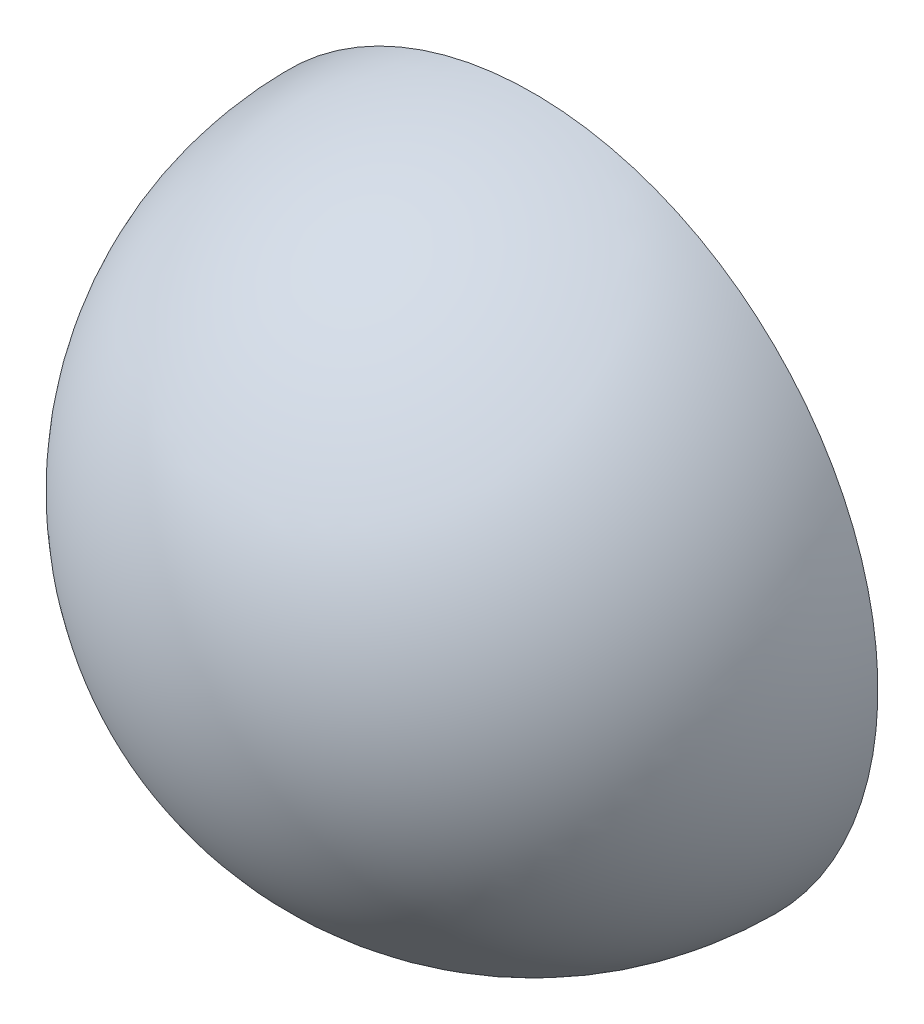
ISO-10303-21;
HEADER;
FILE_DESCRIPTION(('STEP AP214'),'2;1');
FILE_NAME('part.step','',(''),(''),'','','');
FILE_SCHEMA(('AUTOMOTIVE_DESIGN { 1 0 10303 214 1 1 1 1 }'));
ENDSEC;
DATA;
#1=APPLICATION_CONTEXT('core data for automotive mechanical design processes');
#2=APPLICATION_PROTOCOL_DEFINITION('international standard','automotive_design',2000,#1);
#3=PRODUCT_CONTEXT('',#1,'mechanical');
#4=PRODUCT('Part','Part','',(#3));
#5=PRODUCT_RELATED_PRODUCT_CATEGORY('part','',(#4));
#6=PRODUCT_DEFINITION_FORMATION('','',#4);
#7=PRODUCT_DEFINITION_CONTEXT('part definition',#1,'design');
#8=PRODUCT_DEFINITION('design','',#6,#7);
#9=PRODUCT_DEFINITION_SHAPE('','',#8);
#10=(LENGTH_UNIT() NAMED_UNIT(*) SI_UNIT(.MILLI.,.METRE.));
#11=(NAMED_UNIT(*) PLANE_ANGLE_UNIT() SI_UNIT($,.RADIAN.));
#12=(NAMED_UNIT(*) SI_UNIT($,.STERADIAN.) SOLID_ANGLE_UNIT());
#13=UNCERTAINTY_MEASURE_WITH_UNIT(LENGTH_MEASURE(1.E-05),#10,'distance_accuracy_value','');
#14=(GEOMETRIC_REPRESENTATION_CONTEXT(3) GLOBAL_UNCERTAINTY_ASSIGNED_CONTEXT((#13)) GLOBAL_UNIT_ASSIGNED_CONTEXT((#10,
#11,#12)) REPRESENTATION_CONTEXT('',''));
#15=CARTESIAN_POINT('',(0.,0.,0.));
#16=DIRECTION('',(0.,0.,1.));
#17=DIRECTION('',(1.,0.,0.));
#18=AXIS2_PLACEMENT_3D('',#15,#16,#17);
#19=CARTESIAN_POINT('',(0.,0.,0.));
#20=DIRECTION('',(0.,0.,-1.));
#21=DIRECTION('',(-1.,0.,0.));
#22=AXIS2_PLACEMENT_3D('',#19,#20,#21);
#23=PLANE('',#22);
#24=CARTESIAN_POINT('',(0.,0.,0.));
#25=DIRECTION('',(0.,0.,-1.));
#26=DIRECTION('',(-1.,0.,0.));
#27=AXIS2_PLACEMENT_3D('',#24,#25,#26);
#28=CIRCLE('',#27,3.);
#29=CARTESIAN_POINT('',(-3.,0.,0.));
#30=VERTEX_POINT('',#29);
#31=EDGE_CURVE('E10',#30,#30,#28,.T.);
#32=ORIENTED_EDGE('',*,*,#31,.T.);
#33=EDGE_LOOP('',(#32));
#34=FACE_BOUND('',#33,.T.);
#35=ADVANCED_FACE('F32',(#34),#23,.T.);
#36=CARTESIAN_POINT('',(0.,0.,0.));
#37=DIRECTION('',(0.,0.,-1.));
#38=DIRECTION('',(-1.,0.,0.));
#39=AXIS2_PLACEMENT_3D('',#36,#37,#38);
#40=SPHERICAL_SURFACE('',#39,3.);
#41=ORIENTED_EDGE('',*,*,#31,.F.);
#42=EDGE_LOOP('',(#41));
#43=FACE_BOUND('',#42,.T.);
#44=ADVANCED_FACE('F40',(#43),#40,.T.);
#45=CLOSED_SHELL('',(#35,#44));
#46=MANIFOLD_SOLID_BREP('B2',#45);
#47=ADVANCED_BREP_SHAPE_REPRESENTATION('',(#18,#46),#14);
#48=SHAPE_DEFINITION_REPRESENTATION(#9,#47);
ENDSEC;
END-ISO-10303-21;
